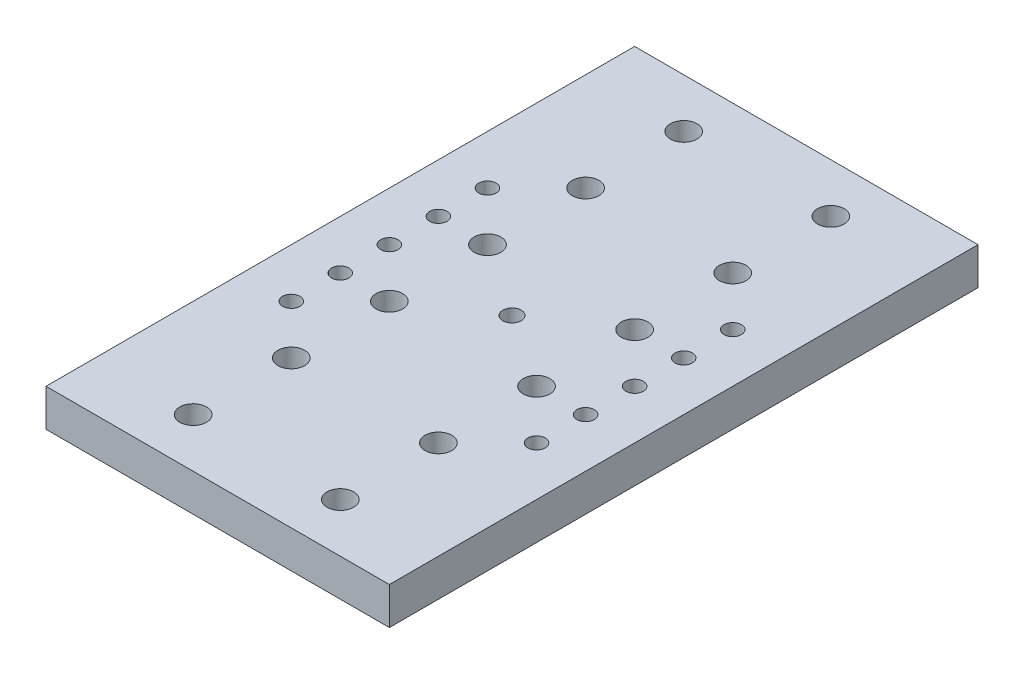
ISO-10303-21;
HEADER;
FILE_DESCRIPTION(('STEP AP214'),'2;1');
FILE_NAME('part.step','',(''),(''),'','','');
FILE_SCHEMA(('AUTOMOTIVE_DESIGN { 1 0 10303 214 1 1 1 1 }'));
ENDSEC;
DATA;
#1=APPLICATION_CONTEXT('core data for automotive mechanical design processes');
#2=APPLICATION_PROTOCOL_DEFINITION('international standard','automotive_design',2000,#1);
#3=PRODUCT_CONTEXT('',#1,'mechanical');
#4=PRODUCT('Part','Part','',(#3));
#5=PRODUCT_RELATED_PRODUCT_CATEGORY('part','',(#4));
#6=PRODUCT_DEFINITION_FORMATION('','',#4);
#7=PRODUCT_DEFINITION_CONTEXT('part definition',#1,'design');
#8=PRODUCT_DEFINITION('design','',#6,#7);
#9=PRODUCT_DEFINITION_SHAPE('','',#8);
#10=(LENGTH_UNIT() NAMED_UNIT(*) SI_UNIT(.MILLI.,.METRE.));
#11=(NAMED_UNIT(*) PLANE_ANGLE_UNIT() SI_UNIT($,.RADIAN.));
#12=(NAMED_UNIT(*) SI_UNIT($,.STERADIAN.) SOLID_ANGLE_UNIT());
#13=UNCERTAINTY_MEASURE_WITH_UNIT(LENGTH_MEASURE(1.E-05),#10,'distance_accuracy_value','');
#14=(GEOMETRIC_REPRESENTATION_CONTEXT(3) GLOBAL_UNCERTAINTY_ASSIGNED_CONTEXT((#13)) GLOBAL_UNIT_ASSIGNED_CONTEXT((#10,
#11,#12)) REPRESENTATION_CONTEXT('',''));
#15=CARTESIAN_POINT('',(0.,0.,0.));
#16=DIRECTION('',(0.,0.,1.));
#17=DIRECTION('',(1.,0.,0.));
#18=AXIS2_PLACEMENT_3D('',#15,#16,#17);
#19=CARTESIAN_POINT('',(0.,9.652,0.));
#20=DIRECTION('',(0.,-1.,0.));
#21=DIRECTION('',(0.,0.,-1.));
#22=AXIS2_PLACEMENT_3D('',#19,#20,#21);
#23=PLANE('',#22);
#24=CARTESIAN_POINT('',(31.75,9.652,0.));
#25=DIRECTION('',(0.,1.,0.));
#26=DIRECTION('',(0.,0.,1.));
#27=AXIS2_PLACEMENT_3D('',#24,#25,#26);
#28=CIRCLE('',#27,2.2479);
#29=CARTESIAN_POINT('',(31.75,9.652,2.24789999999998));
#30=VERTEX_POINT('',#29);
#31=EDGE_CURVE('E302',#30,#30,#28,.T.);
#32=ORIENTED_EDGE('',*,*,#31,.F.);
#33=EDGE_LOOP('',(#32));
#34=FACE_BOUND('',#33,.T.);
#35=CARTESIAN_POINT('',(-31.75,9.652,-12.7));
#36=DIRECTION('',(0.,1.,0.));
#37=DIRECTION('',(0.,0.,1.));
#38=AXIS2_PLACEMENT_3D('',#35,#36,#37);
#39=CIRCLE('',#38,2.2479);
#40=CARTESIAN_POINT('',(-31.75,9.652,-10.4521));
#41=VERTEX_POINT('',#40);
#42=EDGE_CURVE('E294',#41,#41,#39,.T.);
#43=ORIENTED_EDGE('',*,*,#42,.F.);
#44=EDGE_LOOP('',(#43));
#45=FACE_BOUND('',#44,.T.);
#46=CARTESIAN_POINT('',(-31.75,9.652,-25.4));
#47=DIRECTION('',(0.,1.,0.));
#48=DIRECTION('',(0.,0.,1.));
#49=AXIS2_PLACEMENT_3D('',#46,#47,#48);
#50=CIRCLE('',#49,2.2479);
#51=CARTESIAN_POINT('',(-31.75,9.652,-23.1521));
#52=VERTEX_POINT('',#51);
#53=EDGE_CURVE('E286',#52,#52,#50,.T.);
#54=ORIENTED_EDGE('',*,*,#53,.F.);
#55=EDGE_LOOP('',(#54));
#56=FACE_BOUND('',#55,.T.);
#57=CARTESIAN_POINT('',(31.75,9.652,-12.7));
#58=DIRECTION('',(0.,1.,0.));
#59=DIRECTION('',(0.,0.,1.));
#60=AXIS2_PLACEMENT_3D('',#57,#58,#59);
#61=CIRCLE('',#60,2.2479);
#62=CARTESIAN_POINT('',(31.75,9.652,-10.4521));
#63=VERTEX_POINT('',#62);
#64=EDGE_CURVE('E270',#63,#63,#61,.T.);
#65=ORIENTED_EDGE('',*,*,#64,.F.);
#66=EDGE_LOOP('',(#65));
#67=FACE_BOUND('',#66,.T.);
#68=CARTESIAN_POINT('',(31.75,9.652,12.7));
#69=DIRECTION('',(0.,1.,0.));
#70=DIRECTION('',(0.,0.,1.));
#71=AXIS2_PLACEMENT_3D('',#68,#69,#70);
#72=CIRCLE('',#71,2.2479);
#73=CARTESIAN_POINT('',(31.75,9.652,14.9479));
#74=VERTEX_POINT('',#73);
#75=EDGE_CURVE('E262',#74,#74,#72,.T.);
#76=ORIENTED_EDGE('',*,*,#75,.F.);
#77=EDGE_LOOP('',(#76));
#78=FACE_BOUND('',#77,.T.);
#79=CARTESIAN_POINT('',(31.75,9.652,25.4));
#80=DIRECTION('',(0.,1.,0.));
#81=DIRECTION('',(0.,0.,1.));
#82=AXIS2_PLACEMENT_3D('',#79,#80,#81);
#83=CIRCLE('',#82,2.2479);
#84=CARTESIAN_POINT('',(31.75,9.652,27.6479));
#85=VERTEX_POINT('',#84);
#86=EDGE_CURVE('E254',#85,#85,#83,.T.);
#87=ORIENTED_EDGE('',*,*,#86,.F.);
#88=EDGE_LOOP('',(#87));
#89=FACE_BOUND('',#88,.T.);
#90=CARTESIAN_POINT('',(-31.75,9.652,25.4));
#91=DIRECTION('',(0.,1.,0.));
#92=DIRECTION('',(0.,0.,1.));
#93=AXIS2_PLACEMENT_3D('',#90,#91,#92);
#94=CIRCLE('',#93,2.2479);
#95=CARTESIAN_POINT('',(-31.75,9.652,27.6479));
#96=VERTEX_POINT('',#95);
#97=EDGE_CURVE('E238',#96,#96,#94,.T.);
#98=ORIENTED_EDGE('',*,*,#97,.F.);
#99=EDGE_LOOP('',(#98));
#100=FACE_BOUND('',#99,.T.);
#101=CARTESIAN_POINT('',(19.05,9.652,-63.5));
#102=DIRECTION('',(0.,1.,0.));
#103=DIRECTION('',(0.,0.,1.));
#104=AXIS2_PLACEMENT_3D('',#101,#102,#103);
#105=CIRCLE('',#104,3.4544);
#106=CARTESIAN_POINT('',(19.05,9.652,-60.0456));
#107=VERTEX_POINT('',#106);
#108=EDGE_CURVE('E230',#107,#107,#105,.T.);
#109=ORIENTED_EDGE('',*,*,#108,.F.);
#110=EDGE_LOOP('',(#109));
#111=FACE_BOUND('',#110,.T.);
#112=CARTESIAN_POINT('',(-19.05,9.652,-63.5));
#113=DIRECTION('',(0.,1.,0.));
#114=DIRECTION('',(0.,0.,1.));
#115=AXIS2_PLACEMENT_3D('',#112,#113,#114);
#116=CIRCLE('',#115,3.4544);
#117=CARTESIAN_POINT('',(-19.05,9.652,-60.0456));
#118=VERTEX_POINT('',#117);
#119=EDGE_CURVE('E222',#118,#118,#116,.T.);
#120=ORIENTED_EDGE('',*,*,#119,.F.);
#121=EDGE_LOOP('',(#120));
#122=FACE_BOUND('',#121,.T.);
#123=CARTESIAN_POINT('',(19.05,9.652,-38.1));
#124=DIRECTION('',(0.,1.,0.));
#125=DIRECTION('',(0.,0.,1.));
#126=AXIS2_PLACEMENT_3D('',#123,#124,#125);
#127=CIRCLE('',#126,3.4544);
#128=CARTESIAN_POINT('',(19.05,9.652,-34.6456));
#129=VERTEX_POINT('',#128);
#130=EDGE_CURVE('E206',#129,#129,#127,.T.);
#131=ORIENTED_EDGE('',*,*,#130,.F.);
#132=EDGE_LOOP('',(#131));
#133=FACE_BOUND('',#132,.T.);
#134=CARTESIAN_POINT('',(19.05,9.652,-12.7));
#135=DIRECTION('',(0.,1.,0.));
#136=DIRECTION('',(0.,0.,1.));
#137=AXIS2_PLACEMENT_3D('',#134,#135,#136);
#138=CIRCLE('',#137,3.4544);
#139=CARTESIAN_POINT('',(19.05,9.652,-9.2456));
#140=VERTEX_POINT('',#139);
#141=EDGE_CURVE('E198',#140,#140,#138,.T.);
#142=ORIENTED_EDGE('',*,*,#141,.F.);
#143=EDGE_LOOP('',(#142));
#144=FACE_BOUND('',#143,.T.);
#145=CARTESIAN_POINT('',(19.05,9.652,12.7));
#146=DIRECTION('',(0.,1.,0.));
#147=DIRECTION('',(0.,0.,1.));
#148=AXIS2_PLACEMENT_3D('',#145,#146,#147);
#149=CIRCLE('',#148,3.4544);
#150=CARTESIAN_POINT('',(19.05,9.652,16.1544));
#151=VERTEX_POINT('',#150);
#152=EDGE_CURVE('E190',#151,#151,#149,.T.);
#153=ORIENTED_EDGE('',*,*,#152,.F.);
#154=EDGE_LOOP('',(#153));
#155=FACE_BOUND('',#154,.T.);
#156=CARTESIAN_POINT('',(19.05,9.652,63.5));
#157=DIRECTION('',(0.,1.,0.));
#158=DIRECTION('',(0.,0.,1.));
#159=AXIS2_PLACEMENT_3D('',#156,#157,#158);
#160=CIRCLE('',#159,3.4544);
#161=CARTESIAN_POINT('',(19.05,9.652,66.9544));
#162=VERTEX_POINT('',#161);
#163=EDGE_CURVE('E174',#162,#162,#160,.T.);
#164=ORIENTED_EDGE('',*,*,#163,.F.);
#165=EDGE_LOOP('',(#164));
#166=FACE_BOUND('',#165,.T.);
#167=CARTESIAN_POINT('',(-19.05,9.652,-12.7));
#168=DIRECTION('',(0.,1.,0.));
#169=DIRECTION('',(0.,0.,1.));
#170=AXIS2_PLACEMENT_3D('',#167,#168,#169);
#171=CIRCLE('',#170,3.4544);
#172=CARTESIAN_POINT('',(-19.05,9.652,-9.24560000000002));
#173=VERTEX_POINT('',#172);
#174=EDGE_CURVE('E166',#173,#173,#171,.T.);
#175=ORIENTED_EDGE('',*,*,#174,.F.);
#176=EDGE_LOOP('',(#175));
#177=FACE_BOUND('',#176,.T.);
#178=CARTESIAN_POINT('',(-19.05,9.652,63.5));
#179=DIRECTION('',(0.,1.,0.));
#180=DIRECTION('',(0.,0.,1.));
#181=AXIS2_PLACEMENT_3D('',#178,#179,#180);
#182=CIRCLE('',#181,3.4544);
#183=CARTESIAN_POINT('',(-19.05,9.652,66.9544));
#184=VERTEX_POINT('',#183);
#185=EDGE_CURVE('E142',#184,#184,#182,.T.);
#186=ORIENTED_EDGE('',*,*,#185,.F.);
#187=EDGE_LOOP('',(#186));
#188=FACE_BOUND('',#187,.T.);
#189=DIRECTION('',(0.,0.,-1.));
#190=VECTOR('',#189,1.);
#191=CARTESIAN_POINT('',(44.45,9.652,76.2));
#192=LINE('',#191,#190);
#193=CARTESIAN_POINT('',(44.45,9.652,76.2));
#194=VERTEX_POINT('',#193);
#195=CARTESIAN_POINT('',(44.45,9.652,-76.2));
#196=VERTEX_POINT('',#195);
#197=EDGE_CURVE('E93',#194,#196,#192,.T.);
#198=ORIENTED_EDGE('',*,*,#197,.T.);
#199=DIRECTION('',(-1.,0.,0.));
#200=VECTOR('',#199,1.);
#201=CARTESIAN_POINT('',(-44.45,9.652,-76.2));
#202=LINE('',#201,#200);
#203=CARTESIAN_POINT('',(-44.45,9.652,-76.2));
#204=VERTEX_POINT('',#203);
#205=EDGE_CURVE('E88',#196,#204,#202,.T.);
#206=ORIENTED_EDGE('',*,*,#205,.T.);
#207=DIRECTION('',(0.,0.,1.));
#208=VECTOR('',#207,1.);
#209=CARTESIAN_POINT('',(-44.45,9.652,76.2));
#210=LINE('',#209,#208);
#211=CARTESIAN_POINT('',(-44.45,9.652,76.2));
#212=VERTEX_POINT('',#211);
#213=EDGE_CURVE('E91',#204,#212,#210,.T.);
#214=ORIENTED_EDGE('',*,*,#213,.T.);
#215=DIRECTION('',(1.,0.,0.));
#216=VECTOR('',#215,1.);
#217=CARTESIAN_POINT('',(-44.45,9.652,76.2));
#218=LINE('',#217,#216);
#219=EDGE_CURVE('E58',#212,#194,#218,.T.);
#220=ORIENTED_EDGE('',*,*,#219,.T.);
#221=EDGE_LOOP('',(#198,#206,#214,#220));
#222=FACE_BOUND('',#221,.T.);
#223=CARTESIAN_POINT('',(0.,9.652,0.));
#224=DIRECTION('',(0.,1.,0.));
#225=DIRECTION('',(0.,0.,1.));
#226=AXIS2_PLACEMENT_3D('',#223,#224,#225);
#227=CIRCLE('',#226,2.38125);
#228=CARTESIAN_POINT('',(0.,9.652,2.38125000000003));
#229=VERTEX_POINT('',#228);
#230=EDGE_CURVE('E113',#229,#229,#227,.T.);
#231=ORIENTED_EDGE('',*,*,#230,.F.);
#232=EDGE_LOOP('',(#231));
#233=FACE_BOUND('',#232,.T.);
#234=CARTESIAN_POINT('',(-19.05,9.652,38.1));
#235=DIRECTION('',(0.,1.,0.));
#236=DIRECTION('',(0.,0.,1.));
#237=AXIS2_PLACEMENT_3D('',#234,#235,#236);
#238=CIRCLE('',#237,3.4544);
#239=CARTESIAN_POINT('',(-19.05,9.652,41.5544));
#240=VERTEX_POINT('',#239);
#241=EDGE_CURVE('E150',#240,#240,#238,.T.);
#242=ORIENTED_EDGE('',*,*,#241,.F.);
#243=EDGE_LOOP('',(#242));
#244=FACE_BOUND('',#243,.T.);
#245=CARTESIAN_POINT('',(-19.05,9.652,12.7));
#246=DIRECTION('',(0.,1.,0.));
#247=DIRECTION('',(0.,0.,1.));
#248=AXIS2_PLACEMENT_3D('',#245,#246,#247);
#249=CIRCLE('',#248,3.4544);
#250=CARTESIAN_POINT('',(-19.05,9.652,16.1544));
#251=VERTEX_POINT('',#250);
#252=EDGE_CURVE('E158',#251,#251,#249,.T.);
#253=ORIENTED_EDGE('',*,*,#252,.F.);
#254=EDGE_LOOP('',(#253));
#255=FACE_BOUND('',#254,.T.);
#256=CARTESIAN_POINT('',(19.05,9.652,38.1));
#257=DIRECTION('',(0.,1.,0.));
#258=DIRECTION('',(0.,0.,1.));
#259=AXIS2_PLACEMENT_3D('',#256,#257,#258);
#260=CIRCLE('',#259,3.4544);
#261=CARTESIAN_POINT('',(19.05,9.652,41.5544));
#262=VERTEX_POINT('',#261);
#263=EDGE_CURVE('E182',#262,#262,#260,.T.);
#264=ORIENTED_EDGE('',*,*,#263,.F.);
#265=EDGE_LOOP('',(#264));
#266=FACE_BOUND('',#265,.T.);
#267=CARTESIAN_POINT('',(-19.05,9.652,-38.1));
#268=DIRECTION('',(0.,1.,0.));
#269=DIRECTION('',(0.,0.,1.));
#270=AXIS2_PLACEMENT_3D('',#267,#268,#269);
#271=CIRCLE('',#270,3.4544);
#272=CARTESIAN_POINT('',(-19.05,9.652,-34.6456));
#273=VERTEX_POINT('',#272);
#274=EDGE_CURVE('E214',#273,#273,#271,.T.);
#275=ORIENTED_EDGE('',*,*,#274,.F.);
#276=EDGE_LOOP('',(#275));
#277=FACE_BOUND('',#276,.T.);
#278=CARTESIAN_POINT('',(-31.75,9.652,12.7));
#279=DIRECTION('',(0.,1.,0.));
#280=DIRECTION('',(0.,0.,1.));
#281=AXIS2_PLACEMENT_3D('',#278,#279,#280);
#282=CIRCLE('',#281,2.2479);
#283=CARTESIAN_POINT('',(-31.75,9.652,14.9479));
#284=VERTEX_POINT('',#283);
#285=EDGE_CURVE('E246',#284,#284,#282,.T.);
#286=ORIENTED_EDGE('',*,*,#285,.F.);
#287=EDGE_LOOP('',(#286));
#288=FACE_BOUND('',#287,.T.);
#289=CARTESIAN_POINT('',(31.75,9.652,-25.4));
#290=DIRECTION('',(0.,1.,0.));
#291=DIRECTION('',(0.,0.,1.));
#292=AXIS2_PLACEMENT_3D('',#289,#290,#291);
#293=CIRCLE('',#292,2.2479);
#294=CARTESIAN_POINT('',(31.75,9.652,-23.1521));
#295=VERTEX_POINT('',#294);
#296=EDGE_CURVE('E278',#295,#295,#293,.T.);
#297=ORIENTED_EDGE('',*,*,#296,.F.);
#298=EDGE_LOOP('',(#297));
#299=FACE_BOUND('',#298,.T.);
#300=CARTESIAN_POINT('',(-31.75,9.652,0.));
#301=DIRECTION('',(0.,1.,0.));
#302=DIRECTION('',(0.,0.,1.));
#303=AXIS2_PLACEMENT_3D('',#300,#301,#302);
#304=CIRCLE('',#303,2.2479);
#305=CARTESIAN_POINT('',(-31.75,9.652,2.24789999999999));
#306=VERTEX_POINT('',#305);
#307=EDGE_CURVE('E310',#306,#306,#304,.T.);
#308=ORIENTED_EDGE('',*,*,#307,.F.);
#309=EDGE_LOOP('',(#308));
#310=FACE_BOUND('',#309,.T.);
#311=ADVANCED_FACE('F40',(#34,#45,#56,#67,#78,#89,#100,#111,#122,#133,#144,#155,#166,#177,#188,
#222,#233,#244,#255,#266,#277,#288,#299,#310),#23,.F.);
#312=CARTESIAN_POINT('',(0.,0.,0.));
#313=DIRECTION('',(0.,-1.,0.));
#314=DIRECTION('',(0.,0.,-1.));
#315=AXIS2_PLACEMENT_3D('',#312,#313,#314);
#316=PLANE('',#315);
#317=CARTESIAN_POINT('',(-31.75,0.,0.));
#318=DIRECTION('',(0.,1.,0.));
#319=DIRECTION('',(0.,0.,1.));
#320=AXIS2_PLACEMENT_3D('',#317,#318,#319);
#321=CIRCLE('',#320,2.2479);
#322=CARTESIAN_POINT('',(-31.75,0.,2.24789999999998));
#323=VERTEX_POINT('',#322);
#324=EDGE_CURVE('E306',#323,#323,#321,.T.);
#325=ORIENTED_EDGE('',*,*,#324,.T.);
#326=EDGE_LOOP('',(#325));
#327=FACE_BOUND('',#326,.T.);
#328=CARTESIAN_POINT('',(31.75,0.,0.));
#329=DIRECTION('',(0.,1.,0.));
#330=DIRECTION('',(0.,0.,1.));
#331=AXIS2_PLACEMENT_3D('',#328,#329,#330);
#332=CIRCLE('',#331,2.2479);
#333=CARTESIAN_POINT('',(31.75,0.,2.24789999999998));
#334=VERTEX_POINT('',#333);
#335=EDGE_CURVE('E298',#334,#334,#332,.T.);
#336=ORIENTED_EDGE('',*,*,#335,.T.);
#337=EDGE_LOOP('',(#336));
#338=FACE_BOUND('',#337,.T.);
#339=CARTESIAN_POINT('',(31.75,0.,12.7));
#340=DIRECTION('',(0.,1.,0.));
#341=DIRECTION('',(0.,0.,1.));
#342=AXIS2_PLACEMENT_3D('',#339,#340,#341);
#343=CIRCLE('',#342,2.2479);
#344=CARTESIAN_POINT('',(31.75,0.,14.9479));
#345=VERTEX_POINT('',#344);
#346=EDGE_CURVE('E258',#345,#345,#343,.T.);
#347=ORIENTED_EDGE('',*,*,#346,.T.);
#348=EDGE_LOOP('',(#347));
#349=FACE_BOUND('',#348,.T.);
#350=CARTESIAN_POINT('',(31.75,0.,25.4));
#351=DIRECTION('',(0.,1.,0.));
#352=DIRECTION('',(0.,0.,1.));
#353=AXIS2_PLACEMENT_3D('',#350,#351,#352);
#354=CIRCLE('',#353,2.2479);
#355=CARTESIAN_POINT('',(31.75,0.,27.6479));
#356=VERTEX_POINT('',#355);
#357=EDGE_CURVE('E250',#356,#356,#354,.T.);
#358=ORIENTED_EDGE('',*,*,#357,.T.);
#359=EDGE_LOOP('',(#358));
#360=FACE_BOUND('',#359,.T.);
#361=CARTESIAN_POINT('',(-31.75,0.,12.7));
#362=DIRECTION('',(0.,1.,0.));
#363=DIRECTION('',(0.,0.,1.));
#364=AXIS2_PLACEMENT_3D('',#361,#362,#363);
#365=CIRCLE('',#364,2.2479);
#366=CARTESIAN_POINT('',(-31.75,0.,14.9479));
#367=VERTEX_POINT('',#366);
#368=EDGE_CURVE('E242',#367,#367,#365,.T.);
#369=ORIENTED_EDGE('',*,*,#368,.T.);
#370=EDGE_LOOP('',(#369));
#371=FACE_BOUND('',#370,.T.);
#372=CARTESIAN_POINT('',(-31.75,0.,25.4));
#373=DIRECTION('',(0.,1.,0.));
#374=DIRECTION('',(0.,0.,1.));
#375=AXIS2_PLACEMENT_3D('',#372,#373,#374);
#376=CIRCLE('',#375,2.2479);
#377=CARTESIAN_POINT('',(-31.75,0.,27.6479));
#378=VERTEX_POINT('',#377);
#379=EDGE_CURVE('E234',#378,#378,#376,.T.);
#380=ORIENTED_EDGE('',*,*,#379,.T.);
#381=EDGE_LOOP('',(#380));
#382=FACE_BOUND('',#381,.T.);
#383=CARTESIAN_POINT('',(19.05,0.,-12.7));
#384=DIRECTION('',(0.,1.,0.));
#385=DIRECTION('',(0.,0.,1.));
#386=AXIS2_PLACEMENT_3D('',#383,#384,#385);
#387=CIRCLE('',#386,3.4544);
#388=CARTESIAN_POINT('',(19.05,0.,-9.2456));
#389=VERTEX_POINT('',#388);
#390=EDGE_CURVE('E194',#389,#389,#387,.T.);
#391=ORIENTED_EDGE('',*,*,#390,.T.);
#392=EDGE_LOOP('',(#391));
#393=FACE_BOUND('',#392,.T.);
#394=CARTESIAN_POINT('',(19.05,0.,12.7));
#395=DIRECTION('',(0.,1.,0.));
#396=DIRECTION('',(0.,0.,1.));
#397=AXIS2_PLACEMENT_3D('',#394,#395,#396);
#398=CIRCLE('',#397,3.4544);
#399=CARTESIAN_POINT('',(19.05,0.,16.1544));
#400=VERTEX_POINT('',#399);
#401=EDGE_CURVE('E186',#400,#400,#398,.T.);
#402=ORIENTED_EDGE('',*,*,#401,.T.);
#403=EDGE_LOOP('',(#402));
#404=FACE_BOUND('',#403,.T.);
#405=CARTESIAN_POINT('',(19.05,0.,38.1));
#406=DIRECTION('',(0.,1.,0.));
#407=DIRECTION('',(0.,0.,1.));
#408=AXIS2_PLACEMENT_3D('',#405,#406,#407);
#409=CIRCLE('',#408,3.4544);
#410=CARTESIAN_POINT('',(19.05,0.,41.5544));
#411=VERTEX_POINT('',#410);
#412=EDGE_CURVE('E178',#411,#411,#409,.T.);
#413=ORIENTED_EDGE('',*,*,#412,.T.);
#414=EDGE_LOOP('',(#413));
#415=FACE_BOUND('',#414,.T.);
#416=CARTESIAN_POINT('',(19.05,0.,63.5));
#417=DIRECTION('',(0.,1.,0.));
#418=DIRECTION('',(0.,0.,1.));
#419=AXIS2_PLACEMENT_3D('',#416,#417,#418);
#420=CIRCLE('',#419,3.4544);
#421=CARTESIAN_POINT('',(19.05,0.,66.9544));
#422=VERTEX_POINT('',#421);
#423=EDGE_CURVE('E170',#422,#422,#420,.T.);
#424=ORIENTED_EDGE('',*,*,#423,.T.);
#425=EDGE_LOOP('',(#424));
#426=FACE_BOUND('',#425,.T.);
#427=CARTESIAN_POINT('',(-19.05,0.,38.1));
#428=DIRECTION('',(0.,1.,0.));
#429=DIRECTION('',(0.,0.,1.));
#430=AXIS2_PLACEMENT_3D('',#427,#428,#429);
#431=CIRCLE('',#430,3.4544);
#432=CARTESIAN_POINT('',(-19.05,0.,41.5544));
#433=VERTEX_POINT('',#432);
#434=EDGE_CURVE('E146',#433,#433,#431,.T.);
#435=ORIENTED_EDGE('',*,*,#434,.T.);
#436=EDGE_LOOP('',(#435));
#437=FACE_BOUND('',#436,.T.);
#438=CARTESIAN_POINT('',(-19.05,0.,63.5));
#439=DIRECTION('',(0.,1.,0.));
#440=DIRECTION('',(0.,0.,1.));
#441=AXIS2_PLACEMENT_3D('',#438,#439,#440);
#442=CIRCLE('',#441,3.4544);
#443=CARTESIAN_POINT('',(-19.05,0.,66.9544));
#444=VERTEX_POINT('',#443);
#445=EDGE_CURVE('E135',#444,#444,#442,.T.);
#446=ORIENTED_EDGE('',*,*,#445,.T.);
#447=EDGE_LOOP('',(#446));
#448=FACE_BOUND('',#447,.T.);
#449=DIRECTION('',(0.,0.,-1.));
#450=VECTOR('',#449,1.);
#451=CARTESIAN_POINT('',(44.45,0.,76.2));
#452=LINE('',#451,#450);
#453=CARTESIAN_POINT('',(44.45,0.,76.2));
#454=VERTEX_POINT('',#453);
#455=CARTESIAN_POINT('',(44.45,0.,-76.2));
#456=VERTEX_POINT('',#455);
#457=EDGE_CURVE('E109',#454,#456,#452,.T.);
#458=ORIENTED_EDGE('',*,*,#457,.F.);
#459=DIRECTION('',(1.,0.,0.));
#460=VECTOR('',#459,1.);
#461=CARTESIAN_POINT('',(-44.45,0.,76.2));
#462=LINE('',#461,#460);
#463=CARTESIAN_POINT('',(-44.45,0.,76.2));
#464=VERTEX_POINT('',#463);
#465=EDGE_CURVE('E81',#464,#454,#462,.T.);
#466=ORIENTED_EDGE('',*,*,#465,.F.);
#467=DIRECTION('',(0.,0.,1.));
#468=VECTOR('',#467,1.);
#469=CARTESIAN_POINT('',(-44.45,0.,76.2));
#470=LINE('',#469,#468);
#471=CARTESIAN_POINT('',(-44.45,0.,-76.2));
#472=VERTEX_POINT('',#471);
#473=EDGE_CURVE('E75',#472,#464,#470,.T.);
#474=ORIENTED_EDGE('',*,*,#473,.F.);
#475=DIRECTION('',(-1.,0.,0.));
#476=VECTOR('',#475,1.);
#477=CARTESIAN_POINT('',(-44.45,0.,-76.2));
#478=LINE('',#477,#476);
#479=EDGE_CURVE('E98',#456,#472,#478,.T.);
#480=ORIENTED_EDGE('',*,*,#479,.F.);
#481=EDGE_LOOP('',(#458,#466,#474,#480));
#482=FACE_BOUND('',#481,.T.);
#483=CARTESIAN_POINT('',(0.,0.,0.));
#484=DIRECTION('',(0.,1.,0.));
#485=DIRECTION('',(0.,0.,1.));
#486=AXIS2_PLACEMENT_3D('',#483,#484,#485);
#487=CIRCLE('',#486,2.38125);
#488=CARTESIAN_POINT('',(0.,0.,2.38125000000003));
#489=VERTEX_POINT('',#488);
#490=EDGE_CURVE('E131',#489,#489,#487,.T.);
#491=ORIENTED_EDGE('',*,*,#490,.T.);
#492=EDGE_LOOP('',(#491));
#493=FACE_BOUND('',#492,.T.);
#494=CARTESIAN_POINT('',(-19.05,0.,12.7));
#495=DIRECTION('',(0.,1.,0.));
#496=DIRECTION('',(0.,0.,1.));
#497=AXIS2_PLACEMENT_3D('',#494,#495,#496);
#498=CIRCLE('',#497,3.4544);
#499=CARTESIAN_POINT('',(-19.05,0.,16.1544));
#500=VERTEX_POINT('',#499);
#501=EDGE_CURVE('E154',#500,#500,#498,.T.);
#502=ORIENTED_EDGE('',*,*,#501,.T.);
#503=EDGE_LOOP('',(#502));
#504=FACE_BOUND('',#503,.T.);
#505=CARTESIAN_POINT('',(-19.05,0.,-12.7));
#506=DIRECTION('',(0.,1.,0.));
#507=DIRECTION('',(0.,0.,1.));
#508=AXIS2_PLACEMENT_3D('',#505,#506,#507);
#509=CIRCLE('',#508,3.4544);
#510=CARTESIAN_POINT('',(-19.05,0.,-9.24560000000002));
#511=VERTEX_POINT('',#510);
#512=EDGE_CURVE('E162',#511,#511,#509,.T.);
#513=ORIENTED_EDGE('',*,*,#512,.T.);
#514=EDGE_LOOP('',(#513));
#515=FACE_BOUND('',#514,.T.);
#516=CARTESIAN_POINT('',(19.05,0.,-38.1));
#517=DIRECTION('',(0.,1.,0.));
#518=DIRECTION('',(0.,0.,1.));
#519=AXIS2_PLACEMENT_3D('',#516,#517,#518);
#520=CIRCLE('',#519,3.4544);
#521=CARTESIAN_POINT('',(19.05,0.,-34.6456));
#522=VERTEX_POINT('',#521);
#523=EDGE_CURVE('E202',#522,#522,#520,.T.);
#524=ORIENTED_EDGE('',*,*,#523,.T.);
#525=EDGE_LOOP('',(#524));
#526=FACE_BOUND('',#525,.T.);
#527=CARTESIAN_POINT('',(-19.05,0.,-38.1));
#528=DIRECTION('',(0.,1.,0.));
#529=DIRECTION('',(0.,0.,1.));
#530=AXIS2_PLACEMENT_3D('',#527,#528,#529);
#531=CIRCLE('',#530,3.4544);
#532=CARTESIAN_POINT('',(-19.05,0.,-34.6456));
#533=VERTEX_POINT('',#532);
#534=EDGE_CURVE('E210',#533,#533,#531,.T.);
#535=ORIENTED_EDGE('',*,*,#534,.T.);
#536=EDGE_LOOP('',(#535));
#537=FACE_BOUND('',#536,.T.);
#538=CARTESIAN_POINT('',(-19.05,0.,-63.5));
#539=DIRECTION('',(0.,1.,0.));
#540=DIRECTION('',(0.,0.,1.));
#541=AXIS2_PLACEMENT_3D('',#538,#539,#540);
#542=CIRCLE('',#541,3.4544);
#543=CARTESIAN_POINT('',(-19.05,0.,-60.0456));
#544=VERTEX_POINT('',#543);
#545=EDGE_CURVE('E218',#544,#544,#542,.T.);
#546=ORIENTED_EDGE('',*,*,#545,.T.);
#547=EDGE_LOOP('',(#546));
#548=FACE_BOUND('',#547,.T.);
#549=CARTESIAN_POINT('',(19.05,0.,-63.5));
#550=DIRECTION('',(0.,1.,0.));
#551=DIRECTION('',(0.,0.,1.));
#552=AXIS2_PLACEMENT_3D('',#549,#550,#551);
#553=CIRCLE('',#552,3.4544);
#554=CARTESIAN_POINT('',(19.05,0.,-60.0456));
#555=VERTEX_POINT('',#554);
#556=EDGE_CURVE('E226',#555,#555,#553,.T.);
#557=ORIENTED_EDGE('',*,*,#556,.T.);
#558=EDGE_LOOP('',(#557));
#559=FACE_BOUND('',#558,.T.);
#560=CARTESIAN_POINT('',(31.75,0.,-12.7));
#561=DIRECTION('',(0.,1.,0.));
#562=DIRECTION('',(0.,0.,1.));
#563=AXIS2_PLACEMENT_3D('',#560,#561,#562);
#564=CIRCLE('',#563,2.2479);
#565=CARTESIAN_POINT('',(31.75,0.,-10.4521));
#566=VERTEX_POINT('',#565);
#567=EDGE_CURVE('E266',#566,#566,#564,.T.);
#568=ORIENTED_EDGE('',*,*,#567,.T.);
#569=EDGE_LOOP('',(#568));
#570=FACE_BOUND('',#569,.T.);
#571=CARTESIAN_POINT('',(31.75,0.,-25.4));
#572=DIRECTION('',(0.,1.,0.));
#573=DIRECTION('',(0.,0.,1.));
#574=AXIS2_PLACEMENT_3D('',#571,#572,#573);
#575=CIRCLE('',#574,2.2479);
#576=CARTESIAN_POINT('',(31.75,0.,-23.1521));
#577=VERTEX_POINT('',#576);
#578=EDGE_CURVE('E274',#577,#577,#575,.T.);
#579=ORIENTED_EDGE('',*,*,#578,.T.);
#580=EDGE_LOOP('',(#579));
#581=FACE_BOUND('',#580,.T.);
#582=CARTESIAN_POINT('',(-31.75,0.,-25.4));
#583=DIRECTION('',(0.,1.,0.));
#584=DIRECTION('',(0.,0.,1.));
#585=AXIS2_PLACEMENT_3D('',#582,#583,#584);
#586=CIRCLE('',#585,2.2479);
#587=CARTESIAN_POINT('',(-31.75,0.,-23.1521));
#588=VERTEX_POINT('',#587);
#589=EDGE_CURVE('E282',#588,#588,#586,.T.);
#590=ORIENTED_EDGE('',*,*,#589,.T.);
#591=EDGE_LOOP('',(#590));
#592=FACE_BOUND('',#591,.T.);
#593=CARTESIAN_POINT('',(-31.75,0.,-12.7));
#594=DIRECTION('',(0.,1.,0.));
#595=DIRECTION('',(0.,0.,1.));
#596=AXIS2_PLACEMENT_3D('',#593,#594,#595);
#597=CIRCLE('',#596,2.2479);
#598=CARTESIAN_POINT('',(-31.75,0.,-10.4521));
#599=VERTEX_POINT('',#598);
#600=EDGE_CURVE('E290',#599,#599,#597,.T.);
#601=ORIENTED_EDGE('',*,*,#600,.T.);
#602=EDGE_LOOP('',(#601));
#603=FACE_BOUND('',#602,.T.);
#604=ADVANCED_FACE('F126',(#327,#338,#349,#360,#371,#382,#393,#404,#415,#426,#437,#448,#482,
#493,#504,#515,#526,#537,#548,#559,#570,#581,#592,#603),#316,.T.);
#605=CARTESIAN_POINT('',(44.45,9.652,76.2));
#606=DIRECTION('',(-1.,0.,0.));
#607=DIRECTION('',(0.,0.,1.));
#608=AXIS2_PLACEMENT_3D('',#605,#606,#607);
#609=PLANE('',#608);
#610=ORIENTED_EDGE('',*,*,#457,.T.);
#611=DIRECTION('',(0.,-1.,0.));
#612=VECTOR('',#611,1.);
#613=CARTESIAN_POINT('',(44.45,9.652,-76.2));
#614=LINE('',#613,#612);
#615=EDGE_CURVE('E11',#196,#456,#614,.T.);
#616=ORIENTED_EDGE('',*,*,#615,.F.);
#617=ORIENTED_EDGE('',*,*,#197,.F.);
#618=DIRECTION('',(0.,-1.,0.));
#619=VECTOR('',#618,1.);
#620=CARTESIAN_POINT('',(44.45,9.652,76.2));
#621=LINE('',#620,#619);
#622=EDGE_CURVE('E105',#194,#454,#621,.T.);
#623=ORIENTED_EDGE('',*,*,#622,.T.);
#624=EDGE_LOOP('',(#610,#616,#617,#623));
#625=FACE_BOUND('',#624,.T.);
#626=ADVANCED_FACE('F42',(#625),#609,.F.);
#627=CARTESIAN_POINT('',(-44.45,9.652,-76.2));
#628=DIRECTION('',(0.,0.,1.));
#629=DIRECTION('',(1.,0.,0.));
#630=AXIS2_PLACEMENT_3D('',#627,#628,#629);
#631=PLANE('',#630);
#632=ORIENTED_EDGE('',*,*,#479,.T.);
#633=DIRECTION('',(0.,-1.,0.));
#634=VECTOR('',#633,1.);
#635=CARTESIAN_POINT('',(-44.45,9.652,-76.2));
#636=LINE('',#635,#634);
#637=EDGE_CURVE('E50',#204,#472,#636,.T.);
#638=ORIENTED_EDGE('',*,*,#637,.F.);
#639=ORIENTED_EDGE('',*,*,#205,.F.);
#640=ORIENTED_EDGE('',*,*,#615,.T.);
#641=EDGE_LOOP('',(#632,#638,#639,#640));
#642=FACE_BOUND('',#641,.T.);
#643=ADVANCED_FACE('F97',(#642),#631,.F.);
#644=CARTESIAN_POINT('',(-44.45,9.652,76.2));
#645=DIRECTION('',(1.,0.,0.));
#646=DIRECTION('',(0.,0.,-1.));
#647=AXIS2_PLACEMENT_3D('',#644,#645,#646);
#648=PLANE('',#647);
#649=ORIENTED_EDGE('',*,*,#473,.T.);
#650=DIRECTION('',(0.,-1.,0.));
#651=VECTOR('',#650,1.);
#652=CARTESIAN_POINT('',(-44.45,9.652,76.2));
#653=LINE('',#652,#651);
#654=EDGE_CURVE('E100',#212,#464,#653,.T.);
#655=ORIENTED_EDGE('',*,*,#654,.F.);
#656=ORIENTED_EDGE('',*,*,#213,.F.);
#657=ORIENTED_EDGE('',*,*,#637,.T.);
#658=EDGE_LOOP('',(#649,#655,#656,#657));
#659=FACE_BOUND('',#658,.T.);
#660=ADVANCED_FACE('F101',(#659),#648,.F.);
#661=CARTESIAN_POINT('',(-44.45,9.652,76.2));
#662=DIRECTION('',(0.,0.,-1.));
#663=DIRECTION('',(-1.,0.,0.));
#664=AXIS2_PLACEMENT_3D('',#661,#662,#663);
#665=PLANE('',#664);
#666=ORIENTED_EDGE('',*,*,#465,.T.);
#667=ORIENTED_EDGE('',*,*,#622,.F.);
#668=ORIENTED_EDGE('',*,*,#219,.F.);
#669=ORIENTED_EDGE('',*,*,#654,.T.);
#670=EDGE_LOOP('',(#666,#667,#668,#669));
#671=FACE_BOUND('',#670,.T.);
#672=ADVANCED_FACE('F123',(#671),#665,.F.);
#673=CARTESIAN_POINT('',(0.,9.652,0.));
#674=DIRECTION('',(0.,-1.,0.));
#675=DIRECTION('',(0.,0.,-1.));
#676=AXIS2_PLACEMENT_3D('',#673,#674,#675);
#677=CYLINDRICAL_SURFACE('',#676,2.38125);
#678=ORIENTED_EDGE('',*,*,#230,.T.);
#679=EDGE_LOOP('',(#678));
#680=FACE_BOUND('',#679,.T.);
#681=ORIENTED_EDGE('',*,*,#490,.F.);
#682=EDGE_LOOP('',(#681));
#683=FACE_BOUND('',#682,.T.);
#684=ADVANCED_FACE('F329',(#680,#683),#677,.F.);
#685=CARTESIAN_POINT('',(-19.05,9.652,63.5));
#686=DIRECTION('',(0.,1.,0.));
#687=DIRECTION('',(0.,0.,1.));
#688=AXIS2_PLACEMENT_3D('',#685,#686,#687);
#689=CYLINDRICAL_SURFACE('',#688,3.4544);
#690=ORIENTED_EDGE('',*,*,#445,.F.);
#691=EDGE_LOOP('',(#690));
#692=FACE_BOUND('',#691,.T.);
#693=ORIENTED_EDGE('',*,*,#185,.T.);
#694=EDGE_LOOP('',(#693));
#695=FACE_BOUND('',#694,.T.);
#696=ADVANCED_FACE('F366',(#692,#695),#689,.F.);
#697=CARTESIAN_POINT('',(-19.05,9.652,38.1));
#698=DIRECTION('',(0.,1.,0.));
#699=DIRECTION('',(0.,0.,1.));
#700=AXIS2_PLACEMENT_3D('',#697,#698,#699);
#701=CYLINDRICAL_SURFACE('',#700,3.4544);
#702=ORIENTED_EDGE('',*,*,#434,.F.);
#703=EDGE_LOOP('',(#702));
#704=FACE_BOUND('',#703,.T.);
#705=ORIENTED_EDGE('',*,*,#241,.T.);
#706=EDGE_LOOP('',(#705));
#707=FACE_BOUND('',#706,.T.);
#708=ADVANCED_FACE('F377',(#704,#707),#701,.F.);
#709=CARTESIAN_POINT('',(-19.05,9.652,12.7));
#710=DIRECTION('',(0.,1.,0.));
#711=DIRECTION('',(0.,0.,1.));
#712=AXIS2_PLACEMENT_3D('',#709,#710,#711);
#713=CYLINDRICAL_SURFACE('',#712,3.4544);
#714=ORIENTED_EDGE('',*,*,#501,.F.);
#715=EDGE_LOOP('',(#714));
#716=FACE_BOUND('',#715,.T.);
#717=ORIENTED_EDGE('',*,*,#252,.T.);
#718=EDGE_LOOP('',(#717));
#719=FACE_BOUND('',#718,.T.);
#720=ADVANCED_FACE('F388',(#716,#719),#713,.F.);
#721=CARTESIAN_POINT('',(-19.05,9.652,-12.7));
#722=DIRECTION('',(0.,1.,0.));
#723=DIRECTION('',(0.,0.,1.));
#724=AXIS2_PLACEMENT_3D('',#721,#722,#723);
#725=CYLINDRICAL_SURFACE('',#724,3.4544);
#726=ORIENTED_EDGE('',*,*,#512,.F.);
#727=EDGE_LOOP('',(#726));
#728=FACE_BOUND('',#727,.T.);
#729=ORIENTED_EDGE('',*,*,#174,.T.);
#730=EDGE_LOOP('',(#729));
#731=FACE_BOUND('',#730,.T.);
#732=ADVANCED_FACE('F399',(#728,#731),#725,.F.);
#733=CARTESIAN_POINT('',(19.05,9.652,63.5));
#734=DIRECTION('',(0.,1.,0.));
#735=DIRECTION('',(0.,0.,1.));
#736=AXIS2_PLACEMENT_3D('',#733,#734,#735);
#737=CYLINDRICAL_SURFACE('',#736,3.4544);
#738=ORIENTED_EDGE('',*,*,#423,.F.);
#739=EDGE_LOOP('',(#738));
#740=FACE_BOUND('',#739,.T.);
#741=ORIENTED_EDGE('',*,*,#163,.T.);
#742=EDGE_LOOP('',(#741));
#743=FACE_BOUND('',#742,.T.);
#744=ADVANCED_FACE('F410',(#740,#743),#737,.F.);
#745=CARTESIAN_POINT('',(19.05,9.652,38.1));
#746=DIRECTION('',(0.,1.,0.));
#747=DIRECTION('',(0.,0.,1.));
#748=AXIS2_PLACEMENT_3D('',#745,#746,#747);
#749=CYLINDRICAL_SURFACE('',#748,3.4544);
#750=ORIENTED_EDGE('',*,*,#412,.F.);
#751=EDGE_LOOP('',(#750));
#752=FACE_BOUND('',#751,.T.);
#753=ORIENTED_EDGE('',*,*,#263,.T.);
#754=EDGE_LOOP('',(#753));
#755=FACE_BOUND('',#754,.T.);
#756=ADVANCED_FACE('F421',(#752,#755),#749,.F.);
#757=CARTESIAN_POINT('',(19.05,9.652,12.7));
#758=DIRECTION('',(0.,1.,0.));
#759=DIRECTION('',(0.,0.,1.));
#760=AXIS2_PLACEMENT_3D('',#757,#758,#759);
#761=CYLINDRICAL_SURFACE('',#760,3.4544);
#762=ORIENTED_EDGE('',*,*,#401,.F.);
#763=EDGE_LOOP('',(#762));
#764=FACE_BOUND('',#763,.T.);
#765=ORIENTED_EDGE('',*,*,#152,.T.);
#766=EDGE_LOOP('',(#765));
#767=FACE_BOUND('',#766,.T.);
#768=ADVANCED_FACE('F432',(#764,#767),#761,.F.);
#769=CARTESIAN_POINT('',(19.05,9.652,-12.7));
#770=DIRECTION('',(0.,1.,0.));
#771=DIRECTION('',(0.,0.,1.));
#772=AXIS2_PLACEMENT_3D('',#769,#770,#771);
#773=CYLINDRICAL_SURFACE('',#772,3.4544);
#774=ORIENTED_EDGE('',*,*,#390,.F.);
#775=EDGE_LOOP('',(#774));
#776=FACE_BOUND('',#775,.T.);
#777=ORIENTED_EDGE('',*,*,#141,.T.);
#778=EDGE_LOOP('',(#777));
#779=FACE_BOUND('',#778,.T.);
#780=ADVANCED_FACE('F443',(#776,#779),#773,.F.);
#781=CARTESIAN_POINT('',(19.05,9.652,-38.1));
#782=DIRECTION('',(0.,1.,0.));
#783=DIRECTION('',(0.,0.,1.));
#784=AXIS2_PLACEMENT_3D('',#781,#782,#783);
#785=CYLINDRICAL_SURFACE('',#784,3.4544);
#786=ORIENTED_EDGE('',*,*,#523,.F.);
#787=EDGE_LOOP('',(#786));
#788=FACE_BOUND('',#787,.T.);
#789=ORIENTED_EDGE('',*,*,#130,.T.);
#790=EDGE_LOOP('',(#789));
#791=FACE_BOUND('',#790,.T.);
#792=ADVANCED_FACE('F454',(#788,#791),#785,.F.);
#793=CARTESIAN_POINT('',(-19.05,9.652,-38.1));
#794=DIRECTION('',(0.,1.,0.));
#795=DIRECTION('',(0.,0.,1.));
#796=AXIS2_PLACEMENT_3D('',#793,#794,#795);
#797=CYLINDRICAL_SURFACE('',#796,3.4544);
#798=ORIENTED_EDGE('',*,*,#534,.F.);
#799=EDGE_LOOP('',(#798));
#800=FACE_BOUND('',#799,.T.);
#801=ORIENTED_EDGE('',*,*,#274,.T.);
#802=EDGE_LOOP('',(#801));
#803=FACE_BOUND('',#802,.T.);
#804=ADVANCED_FACE('F465',(#800,#803),#797,.F.);
#805=CARTESIAN_POINT('',(-19.05,9.652,-63.5));
#806=DIRECTION('',(0.,1.,0.));
#807=DIRECTION('',(0.,0.,1.));
#808=AXIS2_PLACEMENT_3D('',#805,#806,#807);
#809=CYLINDRICAL_SURFACE('',#808,3.4544);
#810=ORIENTED_EDGE('',*,*,#545,.F.);
#811=EDGE_LOOP('',(#810));
#812=FACE_BOUND('',#811,.T.);
#813=ORIENTED_EDGE('',*,*,#119,.T.);
#814=EDGE_LOOP('',(#813));
#815=FACE_BOUND('',#814,.T.);
#816=ADVANCED_FACE('F476',(#812,#815),#809,.F.);
#817=CARTESIAN_POINT('',(19.05,9.652,-63.5));
#818=DIRECTION('',(0.,1.,0.));
#819=DIRECTION('',(0.,0.,1.));
#820=AXIS2_PLACEMENT_3D('',#817,#818,#819);
#821=CYLINDRICAL_SURFACE('',#820,3.4544);
#822=ORIENTED_EDGE('',*,*,#556,.F.);
#823=EDGE_LOOP('',(#822));
#824=FACE_BOUND('',#823,.T.);
#825=ORIENTED_EDGE('',*,*,#108,.T.);
#826=EDGE_LOOP('',(#825));
#827=FACE_BOUND('',#826,.T.);
#828=ADVANCED_FACE('F486',(#824,#827),#821,.F.);
#829=CARTESIAN_POINT('',(-31.75,9.652,25.4));
#830=DIRECTION('',(0.,1.,0.));
#831=DIRECTION('',(0.,0.,1.));
#832=AXIS2_PLACEMENT_3D('',#829,#830,#831);
#833=CYLINDRICAL_SURFACE('',#832,2.2479);
#834=ORIENTED_EDGE('',*,*,#379,.F.);
#835=EDGE_LOOP('',(#834));
#836=FACE_BOUND('',#835,.T.);
#837=ORIENTED_EDGE('',*,*,#97,.T.);
#838=EDGE_LOOP('',(#837));
#839=FACE_BOUND('',#838,.T.);
#840=ADVANCED_FACE('F496',(#836,#839),#833,.F.);
#841=CARTESIAN_POINT('',(-31.75,9.652,12.7));
#842=DIRECTION('',(0.,1.,0.));
#843=DIRECTION('',(0.,0.,1.));
#844=AXIS2_PLACEMENT_3D('',#841,#842,#843);
#845=CYLINDRICAL_SURFACE('',#844,2.2479);
#846=ORIENTED_EDGE('',*,*,#368,.F.);
#847=EDGE_LOOP('',(#846));
#848=FACE_BOUND('',#847,.T.);
#849=ORIENTED_EDGE('',*,*,#285,.T.);
#850=EDGE_LOOP('',(#849));
#851=FACE_BOUND('',#850,.T.);
#852=ADVANCED_FACE('F508',(#848,#851),#845,.F.);
#853=CARTESIAN_POINT('',(31.75,9.652,25.4));
#854=DIRECTION('',(0.,1.,0.));
#855=DIRECTION('',(0.,0.,1.));
#856=AXIS2_PLACEMENT_3D('',#853,#854,#855);
#857=CYLINDRICAL_SURFACE('',#856,2.2479);
#858=ORIENTED_EDGE('',*,*,#357,.F.);
#859=EDGE_LOOP('',(#858));
#860=FACE_BOUND('',#859,.T.);
#861=ORIENTED_EDGE('',*,*,#86,.T.);
#862=EDGE_LOOP('',(#861));
#863=FACE_BOUND('',#862,.T.);
#864=ADVANCED_FACE('F516',(#860,#863),#857,.F.);
#865=CARTESIAN_POINT('',(31.75,9.652,12.7));
#866=DIRECTION('',(0.,1.,0.));
#867=DIRECTION('',(0.,0.,1.));
#868=AXIS2_PLACEMENT_3D('',#865,#866,#867);
#869=CYLINDRICAL_SURFACE('',#868,2.2479);
#870=ORIENTED_EDGE('',*,*,#346,.F.);
#871=EDGE_LOOP('',(#870));
#872=FACE_BOUND('',#871,.T.);
#873=ORIENTED_EDGE('',*,*,#75,.T.);
#874=EDGE_LOOP('',(#873));
#875=FACE_BOUND('',#874,.T.);
#876=ADVANCED_FACE('F524',(#872,#875),#869,.F.);
#877=CARTESIAN_POINT('',(31.75,9.652,-12.7));
#878=DIRECTION('',(0.,1.,0.));
#879=DIRECTION('',(0.,0.,1.));
#880=AXIS2_PLACEMENT_3D('',#877,#878,#879);
#881=CYLINDRICAL_SURFACE('',#880,2.2479);
#882=ORIENTED_EDGE('',*,*,#567,.F.);
#883=EDGE_LOOP('',(#882));
#884=FACE_BOUND('',#883,.T.);
#885=ORIENTED_EDGE('',*,*,#64,.T.);
#886=EDGE_LOOP('',(#885));
#887=FACE_BOUND('',#886,.T.);
#888=ADVANCED_FACE('F532',(#884,#887),#881,.F.);
#889=CARTESIAN_POINT('',(31.75,9.652,-25.4));
#890=DIRECTION('',(0.,1.,0.));
#891=DIRECTION('',(0.,0.,1.));
#892=AXIS2_PLACEMENT_3D('',#889,#890,#891);
#893=CYLINDRICAL_SURFACE('',#892,2.2479);
#894=ORIENTED_EDGE('',*,*,#578,.F.);
#895=EDGE_LOOP('',(#894));
#896=FACE_BOUND('',#895,.T.);
#897=ORIENTED_EDGE('',*,*,#296,.T.);
#898=EDGE_LOOP('',(#897));
#899=FACE_BOUND('',#898,.T.);
#900=ADVANCED_FACE('F540',(#896,#899),#893,.F.);
#901=CARTESIAN_POINT('',(-31.75,9.652,-25.4));
#902=DIRECTION('',(0.,1.,0.));
#903=DIRECTION('',(0.,0.,1.));
#904=AXIS2_PLACEMENT_3D('',#901,#902,#903);
#905=CYLINDRICAL_SURFACE('',#904,2.2479);
#906=ORIENTED_EDGE('',*,*,#589,.F.);
#907=EDGE_LOOP('',(#906));
#908=FACE_BOUND('',#907,.T.);
#909=ORIENTED_EDGE('',*,*,#53,.T.);
#910=EDGE_LOOP('',(#909));
#911=FACE_BOUND('',#910,.T.);
#912=ADVANCED_FACE('F548',(#908,#911),#905,.F.);
#913=CARTESIAN_POINT('',(-31.75,9.652,-12.7));
#914=DIRECTION('',(0.,1.,0.));
#915=DIRECTION('',(0.,0.,1.));
#916=AXIS2_PLACEMENT_3D('',#913,#914,#915);
#917=CYLINDRICAL_SURFACE('',#916,2.2479);
#918=ORIENTED_EDGE('',*,*,#600,.F.);
#919=EDGE_LOOP('',(#918));
#920=FACE_BOUND('',#919,.T.);
#921=ORIENTED_EDGE('',*,*,#42,.T.);
#922=EDGE_LOOP('',(#921));
#923=FACE_BOUND('',#922,.T.);
#924=ADVANCED_FACE('F556',(#920,#923),#917,.F.);
#925=CARTESIAN_POINT('',(31.75,9.652,0.));
#926=DIRECTION('',(0.,1.,0.));
#927=DIRECTION('',(0.,0.,1.));
#928=AXIS2_PLACEMENT_3D('',#925,#926,#927);
#929=CYLINDRICAL_SURFACE('',#928,2.2479);
#930=ORIENTED_EDGE('',*,*,#335,.F.);
#931=EDGE_LOOP('',(#930));
#932=FACE_BOUND('',#931,.T.);
#933=ORIENTED_EDGE('',*,*,#31,.T.);
#934=EDGE_LOOP('',(#933));
#935=FACE_BOUND('',#934,.T.);
#936=ADVANCED_FACE('F564',(#932,#935),#929,.F.);
#937=CARTESIAN_POINT('',(-31.75,9.652,0.));
#938=DIRECTION('',(0.,1.,0.));
#939=DIRECTION('',(0.,0.,1.));
#940=AXIS2_PLACEMENT_3D('',#937,#938,#939);
#941=CYLINDRICAL_SURFACE('',#940,2.2479);
#942=ORIENTED_EDGE('',*,*,#324,.F.);
#943=EDGE_LOOP('',(#942));
#944=FACE_BOUND('',#943,.T.);
#945=ORIENTED_EDGE('',*,*,#307,.T.);
#946=EDGE_LOOP('',(#945));
#947=FACE_BOUND('',#946,.T.);
#948=ADVANCED_FACE('F315',(#944,#947),#941,.F.);
#949=CLOSED_SHELL('',(#311,#604,#626,#643,#660,#672,#684,#696,#708,#720,#732,#744,#756,#768,
#780,#792,#804,#816,#828,#840,#852,#864,#876,#888,#900,#912,#924,#936,#948));
#950=MANIFOLD_SOLID_BREP('B2',#949);
#951=ADVANCED_BREP_SHAPE_REPRESENTATION('',(#18,#950),#14);
#952=SHAPE_DEFINITION_REPRESENTATION(#9,#951);
ENDSEC;
END-ISO-10303-21;
